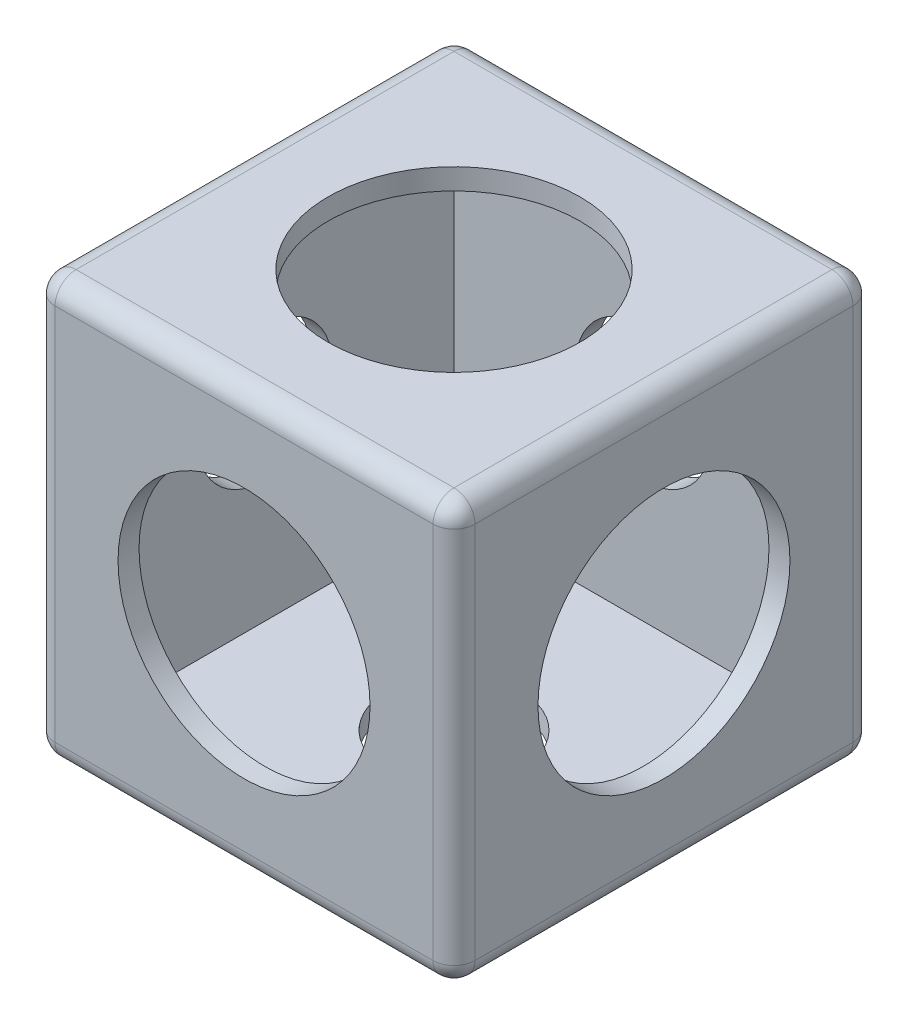
ISO-10303-21;
HEADER;
FILE_DESCRIPTION(('STEP AP214'),'2;1');
FILE_NAME('part.step','',(''),(''),'','','');
FILE_SCHEMA(('AUTOMOTIVE_DESIGN { 1 0 10303 214 1 1 1 1 }'));
ENDSEC;
DATA;
#1=APPLICATION_CONTEXT('core data for automotive mechanical design processes');
#2=APPLICATION_PROTOCOL_DEFINITION('international standard','automotive_design',2000,#1);
#3=PRODUCT_CONTEXT('',#1,'mechanical');
#4=PRODUCT('Part','Part','',(#3));
#5=PRODUCT_RELATED_PRODUCT_CATEGORY('part','',(#4));
#6=PRODUCT_DEFINITION_FORMATION('','',#4);
#7=PRODUCT_DEFINITION_CONTEXT('part definition',#1,'design');
#8=PRODUCT_DEFINITION('design','',#6,#7);
#9=PRODUCT_DEFINITION_SHAPE('','',#8);
#10=(LENGTH_UNIT() NAMED_UNIT(*) SI_UNIT(.MILLI.,.METRE.));
#11=(NAMED_UNIT(*) PLANE_ANGLE_UNIT() SI_UNIT($,.RADIAN.));
#12=(NAMED_UNIT(*) SI_UNIT($,.STERADIAN.) SOLID_ANGLE_UNIT());
#13=UNCERTAINTY_MEASURE_WITH_UNIT(LENGTH_MEASURE(1.E-05),#10,'distance_accuracy_value','');
#14=(GEOMETRIC_REPRESENTATION_CONTEXT(3) GLOBAL_UNCERTAINTY_ASSIGNED_CONTEXT((#13)) GLOBAL_UNIT_ASSIGNED_CONTEXT((#10,
#11,#12)) REPRESENTATION_CONTEXT('',''));
#15=CARTESIAN_POINT('',(0.,0.,0.));
#16=DIRECTION('',(0.,0.,1.));
#17=DIRECTION('',(1.,0.,0.));
#18=AXIS2_PLACEMENT_3D('',#15,#16,#17);
#19=CARTESIAN_POINT('',(0.,0.5,0.));
#20=DIRECTION('',(0.,-1.,0.));
#21=DIRECTION('',(0.,0.,-1.));
#22=AXIS2_PLACEMENT_3D('',#19,#20,#21);
#23=PLANE('',#22);
#24=DIRECTION('',(-1.,0.,0.));
#25=VECTOR('',#24,1.);
#26=CARTESIAN_POINT('',(0.5,0.5,-9.5));
#27=LINE('',#26,#25);
#28=CARTESIAN_POINT('',(9.5,0.5,-9.5));
#29=VERTEX_POINT('',#28);
#30=CARTESIAN_POINT('',(0.5,0.5,-9.5));
#31=VERTEX_POINT('',#30);
#32=EDGE_CURVE('E175',#29,#31,#27,.T.);
#33=ORIENTED_EDGE('',*,*,#32,.T.);
#34=DIRECTION('',(0.,0.,1.));
#35=VECTOR('',#34,1.);
#36=CARTESIAN_POINT('',(0.5,0.5,-0.5));
#37=LINE('',#36,#35);
#38=CARTESIAN_POINT('',(0.5,0.5,-0.5));
#39=VERTEX_POINT('',#38);
#40=EDGE_CURVE('E339',#31,#39,#37,.T.);
#41=ORIENTED_EDGE('',*,*,#40,.T.);
#42=DIRECTION('',(1.,0.,0.));
#43=VECTOR('',#42,1.);
#44=CARTESIAN_POINT('',(0.5,0.5,-0.5));
#45=LINE('',#44,#43);
#46=CARTESIAN_POINT('',(9.5,0.5,-0.5));
#47=VERTEX_POINT('',#46);
#48=EDGE_CURVE('E179',#39,#47,#45,.T.);
#49=ORIENTED_EDGE('',*,*,#48,.T.);
#50=DIRECTION('',(0.,0.,-1.));
#51=VECTOR('',#50,1.);
#52=CARTESIAN_POINT('',(9.5,0.5,-0.5));
#53=LINE('',#52,#51);
#54=EDGE_CURVE('E347',#47,#29,#53,.T.);
#55=ORIENTED_EDGE('',*,*,#54,.T.);
#56=EDGE_LOOP('',(#33,#41,#49,#55));
#57=FACE_BOUND('',#56,.T.);
#58=CARTESIAN_POINT('',(5.,0.5,-5.));
#59=DIRECTION('',(0.,1.,0.));
#60=DIRECTION('',(0.,0.,1.));
#61=AXIS2_PLACEMENT_3D('',#58,#59,#60);
#62=CIRCLE('',#61,1.6);
#63=CARTESIAN_POINT('',(5.,0.5,-3.4));
#64=VERTEX_POINT('',#63);
#65=EDGE_CURVE('E184',#64,#64,#62,.T.);
#66=ORIENTED_EDGE('',*,*,#65,.F.);
#67=EDGE_LOOP('',(#66));
#68=FACE_BOUND('',#67,.T.);
#69=ADVANCED_FACE('F39',(#57,#68),#23,.F.);
#70=CARTESIAN_POINT('',(0.,0.,0.));
#71=DIRECTION('',(0.,-1.,0.));
#72=DIRECTION('',(0.,0.,-1.));
#73=AXIS2_PLACEMENT_3D('',#70,#71,#72);
#74=PLANE('',#73);
#75=DIRECTION('',(1.,0.,0.));
#76=VECTOR('',#75,1.);
#77=CARTESIAN_POINT('',(0.,0.,-0.5));
#78=LINE('',#77,#76);
#79=CARTESIAN_POINT('',(9.49999999999999,0.,-0.5));
#80=VERTEX_POINT('',#79);
#81=CARTESIAN_POINT('',(0.5,0.,-0.5));
#82=VERTEX_POINT('',#81);
#83=EDGE_CURVE('E205',#80,#82,#78,.F.);
#84=ORIENTED_EDGE('',*,*,#83,.T.);
#85=DIRECTION('',(0.,0.,1.));
#86=VECTOR('',#85,1.);
#87=CARTESIAN_POINT('',(0.5,0.,-9.99999999999999));
#88=LINE('',#87,#86);
#89=CARTESIAN_POINT('',(0.5,0.,-9.49999999999999));
#90=VERTEX_POINT('',#89);
#91=EDGE_CURVE('E207',#82,#90,#88,.F.);
#92=ORIENTED_EDGE('',*,*,#91,.T.);
#93=DIRECTION('',(-1.,0.,0.));
#94=VECTOR('',#93,1.);
#95=CARTESIAN_POINT('',(9.99999999999999,0.,-9.49999999999999));
#96=LINE('',#95,#94);
#97=CARTESIAN_POINT('',(9.49999999999999,0.,-9.49999999999999));
#98=VERTEX_POINT('',#97);
#99=EDGE_CURVE('E201',#90,#98,#96,.F.);
#100=ORIENTED_EDGE('',*,*,#99,.T.);
#101=DIRECTION('',(0.,0.,-1.));
#102=VECTOR('',#101,1.);
#103=CARTESIAN_POINT('',(9.49999999999999,0.,0.));
#104=LINE('',#103,#102);
#105=EDGE_CURVE('E203',#98,#80,#104,.F.);
#106=ORIENTED_EDGE('',*,*,#105,.T.);
#107=EDGE_LOOP('',(#84,#92,#100,#106));
#108=FACE_BOUND('',#107,.T.);
#109=CARTESIAN_POINT('',(5.,0.,-5.));
#110=DIRECTION('',(0.,1.,0.));
#111=DIRECTION('',(0.,0.,1.));
#112=AXIS2_PLACEMENT_3D('',#109,#110,#111);
#113=CIRCLE('',#112,1.6);
#114=CARTESIAN_POINT('',(5.,0.,-3.4));
#115=VERTEX_POINT('',#114);
#116=EDGE_CURVE('E180',#115,#115,#113,.T.);
#117=ORIENTED_EDGE('',*,*,#116,.T.);
#118=EDGE_LOOP('',(#117));
#119=FACE_BOUND('',#118,.T.);
#120=ADVANCED_FACE('F362',(#108,#119),#74,.T.);
#121=CARTESIAN_POINT('',(0.,0.5,0.));
#122=DIRECTION('',(1.,0.,0.));
#123=DIRECTION('',(0.,0.,-1.));
#124=AXIS2_PLACEMENT_3D('',#121,#122,#123);
#125=PLANE('',#124);
#126=DIRECTION('',(0.,-1.,0.));
#127=VECTOR('',#126,1.);
#128=CARTESIAN_POINT('',(0.,0.5,-9.49999999999999));
#129=LINE('',#128,#127);
#130=CARTESIAN_POINT('',(0.,9.5,-9.49999999999999));
#131=VERTEX_POINT('',#130);
#132=CARTESIAN_POINT('',(0.,0.5,-9.49999999999999));
#133=VERTEX_POINT('',#132);
#134=EDGE_CURVE('E196',#131,#133,#129,.T.);
#135=ORIENTED_EDGE('',*,*,#134,.T.);
#136=DIRECTION('',(0.,0.,1.));
#137=VECTOR('',#136,1.);
#138=CARTESIAN_POINT('',(0.,0.5,0.));
#139=LINE('',#138,#137);
#140=CARTESIAN_POINT('',(0.,0.5,-0.5));
#141=VERTEX_POINT('',#140);
#142=EDGE_CURVE('E198',#133,#141,#139,.T.);
#143=ORIENTED_EDGE('',*,*,#142,.T.);
#144=DIRECTION('',(0.,-1.,0.));
#145=VECTOR('',#144,1.);
#146=CARTESIAN_POINT('',(0.,0.5,-0.5));
#147=LINE('',#146,#145);
#148=CARTESIAN_POINT('',(0.,9.5,-0.5));
#149=VERTEX_POINT('',#148);
#150=EDGE_CURVE('E194',#141,#149,#147,.F.);
#151=ORIENTED_EDGE('',*,*,#150,.T.);
#152=DIRECTION('',(0.,0.,1.));
#153=VECTOR('',#152,1.);
#154=CARTESIAN_POINT('',(0.,9.5,-10.));
#155=LINE('',#154,#153);
#156=EDGE_CURVE('E191',#149,#131,#155,.F.);
#157=ORIENTED_EDGE('',*,*,#156,.T.);
#158=EDGE_LOOP('',(#135,#143,#151,#157));
#159=FACE_BOUND('',#158,.T.);
#160=CARTESIAN_POINT('',(0.,5.,-5.));
#161=DIRECTION('',(-1.,0.,0.));
#162=DIRECTION('',(0.,0.,1.));
#163=AXIS2_PLACEMENT_3D('',#160,#161,#162);
#164=CIRCLE('',#163,1.6);
#165=CARTESIAN_POINT('',(0.,5.,-3.4));
#166=VERTEX_POINT('',#165);
#167=EDGE_CURVE('E315',#166,#166,#164,.T.);
#168=ORIENTED_EDGE('',*,*,#167,.F.);
#169=EDGE_LOOP('',(#168));
#170=FACE_BOUND('',#169,.T.);
#171=ADVANCED_FACE('F374',(#159,#170),#125,.F.);
#172=CARTESIAN_POINT('',(0.,0.5,0.));
#173=DIRECTION('',(0.,0.,-1.));
#174=DIRECTION('',(-1.,0.,0.));
#175=AXIS2_PLACEMENT_3D('',#172,#173,#174);
#176=PLANE('',#175);
#177=DIRECTION('',(1.,0.,0.));
#178=VECTOR('',#177,1.);
#179=CARTESIAN_POINT('',(0.,9.5,0.));
#180=LINE('',#179,#178);
#181=CARTESIAN_POINT('',(9.49999999999999,9.5,0.));
#182=VERTEX_POINT('',#181);
#183=CARTESIAN_POINT('',(0.5,9.5,0.));
#184=VERTEX_POINT('',#183);
#185=EDGE_CURVE('E223',#182,#184,#180,.F.);
#186=ORIENTED_EDGE('',*,*,#185,.T.);
#187=DIRECTION('',(0.,-1.,0.));
#188=VECTOR('',#187,1.);
#189=CARTESIAN_POINT('',(0.5,0.5,0.));
#190=LINE('',#189,#188);
#191=CARTESIAN_POINT('',(0.5,0.5,0.));
#192=VERTEX_POINT('',#191);
#193=EDGE_CURVE('E225',#184,#192,#190,.T.);
#194=ORIENTED_EDGE('',*,*,#193,.T.);
#195=DIRECTION('',(1.,0.,0.));
#196=VECTOR('',#195,1.);
#197=CARTESIAN_POINT('',(9.99999999999999,0.5,0.));
#198=LINE('',#197,#196);
#199=CARTESIAN_POINT('',(9.49999999999999,0.5,0.));
#200=VERTEX_POINT('',#199);
#201=EDGE_CURVE('E219',#192,#200,#198,.T.);
#202=ORIENTED_EDGE('',*,*,#201,.T.);
#203=DIRECTION('',(0.,-1.,0.));
#204=VECTOR('',#203,1.);
#205=CARTESIAN_POINT('',(9.49999999999999,0.5,0.));
#206=LINE('',#205,#204);
#207=EDGE_CURVE('E221',#200,#182,#206,.F.);
#208=ORIENTED_EDGE('',*,*,#207,.T.);
#209=EDGE_LOOP('',(#186,#194,#202,#208));
#210=FACE_BOUND('',#209,.T.);
#211=CARTESIAN_POINT('',(5.,5.,0.));
#212=DIRECTION('',(0.,0.,1.));
#213=DIRECTION('',(1.,0.,0.));
#214=AXIS2_PLACEMENT_3D('',#211,#212,#213);
#215=CIRCLE('',#214,3.);
#216=CARTESIAN_POINT('',(8.,5.,0.));
#217=VERTEX_POINT('',#216);
#218=EDGE_CURVE('E321',#217,#217,#215,.T.);
#219=ORIENTED_EDGE('',*,*,#218,.F.);
#220=EDGE_LOOP('',(#219));
#221=FACE_BOUND('',#220,.T.);
#222=ADVANCED_FACE('F381',(#210,#221),#176,.F.);
#223=CARTESIAN_POINT('',(9.99999999999999,0.5,0.));
#224=DIRECTION('',(-1.,0.,0.));
#225=DIRECTION('',(0.,0.,1.));
#226=AXIS2_PLACEMENT_3D('',#223,#224,#225);
#227=PLANE('',#226);
#228=DIRECTION('',(0.,0.,-1.));
#229=VECTOR('',#228,1.);
#230=CARTESIAN_POINT('',(9.99999999999999,9.5,0.));
#231=LINE('',#230,#229);
#232=CARTESIAN_POINT('',(9.99999999999999,9.5,-9.49999999999999));
#233=VERTEX_POINT('',#232);
#234=CARTESIAN_POINT('',(9.99999999999999,9.5,-0.5));
#235=VERTEX_POINT('',#234);
#236=EDGE_CURVE('E63',#233,#235,#231,.F.);
#237=ORIENTED_EDGE('',*,*,#236,.T.);
#238=DIRECTION('',(0.,-1.,0.));
#239=VECTOR('',#238,1.);
#240=CARTESIAN_POINT('',(9.99999999999999,0.5,-0.5));
#241=LINE('',#240,#239);
#242=CARTESIAN_POINT('',(9.99999999999999,0.5,-0.5));
#243=VERTEX_POINT('',#242);
#244=EDGE_CURVE('E11',#235,#243,#241,.T.);
#245=ORIENTED_EDGE('',*,*,#244,.T.);
#246=DIRECTION('',(0.,0.,-1.));
#247=VECTOR('',#246,1.);
#248=CARTESIAN_POINT('',(9.99999999999999,0.5,-9.99999999999999));
#249=LINE('',#248,#247);
#250=CARTESIAN_POINT('',(9.99999999999999,0.5,-9.49999999999999));
#251=VERTEX_POINT('',#250);
#252=EDGE_CURVE('E48',#243,#251,#249,.T.);
#253=ORIENTED_EDGE('',*,*,#252,.T.);
#254=DIRECTION('',(0.,-1.,0.));
#255=VECTOR('',#254,1.);
#256=CARTESIAN_POINT('',(9.99999999999999,0.5,-9.49999999999999));
#257=LINE('',#256,#255);
#258=EDGE_CURVE('E237',#251,#233,#257,.F.);
#259=ORIENTED_EDGE('',*,*,#258,.T.);
#260=EDGE_LOOP('',(#237,#245,#253,#259));
#261=FACE_BOUND('',#260,.T.);
#262=CARTESIAN_POINT('',(9.99999999999999,5.,-5.));
#263=DIRECTION('',(1.,0.,0.));
#264=DIRECTION('',(0.,0.,-1.));
#265=AXIS2_PLACEMENT_3D('',#262,#263,#264);
#266=CIRCLE('',#265,3.);
#267=CARTESIAN_POINT('',(9.99999999999999,5.,-8.));
#268=VERTEX_POINT('',#267);
#269=EDGE_CURVE('E327',#268,#268,#266,.T.);
#270=ORIENTED_EDGE('',*,*,#269,.F.);
#271=EDGE_LOOP('',(#270));
#272=FACE_BOUND('',#271,.T.);
#273=ADVANCED_FACE('F387',(#261,#272),#227,.F.);
#274=CARTESIAN_POINT('',(0.,0.5,-9.99999999999999));
#275=DIRECTION('',(0.,0.,1.));
#276=DIRECTION('',(1.,0.,0.));
#277=AXIS2_PLACEMENT_3D('',#274,#275,#276);
#278=PLANE('',#277);
#279=DIRECTION('',(-1.,0.,0.));
#280=VECTOR('',#279,1.);
#281=CARTESIAN_POINT('',(0.,0.5,-9.99999999999999));
#282=LINE('',#281,#280);
#283=CARTESIAN_POINT('',(9.49999999999999,0.5,-9.99999999999999));
#284=VERTEX_POINT('',#283);
#285=CARTESIAN_POINT('',(0.5,0.5,-9.99999999999999));
#286=VERTEX_POINT('',#285);
#287=EDGE_CURVE('E214',#284,#286,#282,.T.);
#288=ORIENTED_EDGE('',*,*,#287,.T.);
#289=DIRECTION('',(0.,-1.,0.));
#290=VECTOR('',#289,1.);
#291=CARTESIAN_POINT('',(0.5,0.5,-9.99999999999999));
#292=LINE('',#291,#290);
#293=CARTESIAN_POINT('',(0.5,9.5,-9.99999999999999));
#294=VERTEX_POINT('',#293);
#295=EDGE_CURVE('E216',#286,#294,#292,.F.);
#296=ORIENTED_EDGE('',*,*,#295,.T.);
#297=DIRECTION('',(-1.,0.,0.));
#298=VECTOR('',#297,1.);
#299=CARTESIAN_POINT('',(10.,9.5,-9.99999999999999));
#300=LINE('',#299,#298);
#301=CARTESIAN_POINT('',(9.49999999999999,9.5,-9.99999999999999));
#302=VERTEX_POINT('',#301);
#303=EDGE_CURVE('E212',#294,#302,#300,.F.);
#304=ORIENTED_EDGE('',*,*,#303,.T.);
#305=DIRECTION('',(0.,-1.,0.));
#306=VECTOR('',#305,1.);
#307=CARTESIAN_POINT('',(9.49999999999999,0.5,-9.99999999999999));
#308=LINE('',#307,#306);
#309=EDGE_CURVE('E210',#302,#284,#308,.T.);
#310=ORIENTED_EDGE('',*,*,#309,.T.);
#311=EDGE_LOOP('',(#288,#296,#304,#310));
#312=FACE_BOUND('',#311,.T.);
#313=CARTESIAN_POINT('',(5.,5.,-9.99999999999999));
#314=DIRECTION('',(0.,0.,-1.));
#315=DIRECTION('',(-1.,0.,0.));
#316=AXIS2_PLACEMENT_3D('',#313,#314,#315);
#317=CIRCLE('',#316,1.6);
#318=CARTESIAN_POINT('',(3.4,5.,-9.99999999999999));
#319=VERTEX_POINT('',#318);
#320=EDGE_CURVE('E304',#319,#319,#317,.T.);
#321=ORIENTED_EDGE('',*,*,#320,.F.);
#322=EDGE_LOOP('',(#321));
#323=FACE_BOUND('',#322,.T.);
#324=ADVANCED_FACE('F369',(#312,#323),#278,.F.);
#325=CARTESIAN_POINT('',(5.,0.5,-5.));
#326=DIRECTION('',(0.,-1.,0.));
#327=DIRECTION('',(0.,0.,-1.));
#328=AXIS2_PLACEMENT_3D('',#325,#326,#327);
#329=CYLINDRICAL_SURFACE('',#328,1.6);
#330=ORIENTED_EDGE('',*,*,#65,.T.);
#331=EDGE_LOOP('',(#330));
#332=FACE_BOUND('',#331,.T.);
#333=ORIENTED_EDGE('',*,*,#116,.F.);
#334=EDGE_LOOP('',(#333));
#335=FACE_BOUND('',#334,.T.);
#336=ADVANCED_FACE('F366',(#332,#335),#329,.F.);
#337=CARTESIAN_POINT('',(0.5,9.5,-0.5));
#338=DIRECTION('',(1.,0.,0.));
#339=DIRECTION('',(0.,0.,-1.));
#340=AXIS2_PLACEMENT_3D('',#337,#338,#339);
#341=PLANE('',#340);
#342=CARTESIAN_POINT('',(0.5,5.,-5.));
#343=DIRECTION('',(-1.,0.,0.));
#344=DIRECTION('',(0.,0.,1.));
#345=AXIS2_PLACEMENT_3D('',#342,#343,#344);
#346=CIRCLE('',#345,1.6);
#347=CARTESIAN_POINT('',(0.5,5.,-3.4));
#348=VERTEX_POINT('',#347);
#349=EDGE_CURVE('E318',#348,#348,#346,.T.);
#350=ORIENTED_EDGE('',*,*,#349,.T.);
#351=EDGE_LOOP('',(#350));
#352=FACE_BOUND('',#351,.T.);
#353=ORIENTED_EDGE('',*,*,#40,.F.);
#354=DIRECTION('',(0.,-1.,0.));
#355=VECTOR('',#354,1.);
#356=CARTESIAN_POINT('',(0.5,9.5,-9.5));
#357=LINE('',#356,#355);
#358=CARTESIAN_POINT('',(0.5,9.5,-9.5));
#359=VERTEX_POINT('',#358);
#360=EDGE_CURVE('E174',#359,#31,#357,.T.);
#361=ORIENTED_EDGE('',*,*,#360,.F.);
#362=DIRECTION('',(0.,0.,1.));
#363=VECTOR('',#362,1.);
#364=CARTESIAN_POINT('',(0.5,9.5,-0.5));
#365=LINE('',#364,#363);
#366=CARTESIAN_POINT('',(0.5,9.5,-0.5));
#367=VERTEX_POINT('',#366);
#368=EDGE_CURVE('E159',#359,#367,#365,.T.);
#369=ORIENTED_EDGE('',*,*,#368,.T.);
#370=DIRECTION('',(0.,-1.,0.));
#371=VECTOR('',#370,1.);
#372=CARTESIAN_POINT('',(0.5,9.5,-0.5));
#373=LINE('',#372,#371);
#374=EDGE_CURVE('E172',#367,#39,#373,.T.);
#375=ORIENTED_EDGE('',*,*,#374,.T.);
#376=EDGE_LOOP('',(#353,#361,#369,#375));
#377=FACE_BOUND('',#376,.T.);
#378=ADVANCED_FACE('F171',(#352,#377),#341,.T.);
#379=CARTESIAN_POINT('',(0.5,9.5,-0.5));
#380=DIRECTION('',(0.,0.,-1.));
#381=DIRECTION('',(-1.,0.,0.));
#382=AXIS2_PLACEMENT_3D('',#379,#380,#381);
#383=PLANE('',#382);
#384=CARTESIAN_POINT('',(5.,5.,-0.5));
#385=DIRECTION('',(0.,0.,1.));
#386=DIRECTION('',(1.,0.,0.));
#387=AXIS2_PLACEMENT_3D('',#384,#385,#386);
#388=CIRCLE('',#387,3.);
#389=CARTESIAN_POINT('',(8.,5.,-0.5));
#390=VERTEX_POINT('',#389);
#391=EDGE_CURVE('E324',#390,#390,#388,.T.);
#392=ORIENTED_EDGE('',*,*,#391,.T.);
#393=EDGE_LOOP('',(#392));
#394=FACE_BOUND('',#393,.T.);
#395=ORIENTED_EDGE('',*,*,#48,.F.);
#396=ORIENTED_EDGE('',*,*,#374,.F.);
#397=DIRECTION('',(1.,0.,0.));
#398=VECTOR('',#397,1.);
#399=CARTESIAN_POINT('',(0.5,9.5,-0.5));
#400=LINE('',#399,#398);
#401=CARTESIAN_POINT('',(9.5,9.5,-0.5));
#402=VERTEX_POINT('',#401);
#403=EDGE_CURVE('E155',#367,#402,#400,.T.);
#404=ORIENTED_EDGE('',*,*,#403,.T.);
#405=DIRECTION('',(0.,-1.,0.));
#406=VECTOR('',#405,1.);
#407=CARTESIAN_POINT('',(9.5,9.5,-0.5));
#408=LINE('',#407,#406);
#409=EDGE_CURVE('E181',#402,#47,#408,.T.);
#410=ORIENTED_EDGE('',*,*,#409,.T.);
#411=EDGE_LOOP('',(#395,#396,#404,#410));
#412=FACE_BOUND('',#411,.T.);
#413=ADVANCED_FACE('F177',(#394,#412),#383,.T.);
#414=CARTESIAN_POINT('',(9.5,9.5,-0.5));
#415=DIRECTION('',(-1.,0.,0.));
#416=DIRECTION('',(0.,0.,1.));
#417=AXIS2_PLACEMENT_3D('',#414,#415,#416);
#418=PLANE('',#417);
#419=CARTESIAN_POINT('',(9.49999999999999,5.,-5.));
#420=DIRECTION('',(1.,0.,0.));
#421=DIRECTION('',(0.,0.,-1.));
#422=AXIS2_PLACEMENT_3D('',#419,#420,#421);
#423=CIRCLE('',#422,3.);
#424=CARTESIAN_POINT('',(9.49999999999999,5.,-8.));
#425=VERTEX_POINT('',#424);
#426=EDGE_CURVE('E330',#425,#425,#423,.T.);
#427=ORIENTED_EDGE('',*,*,#426,.T.);
#428=EDGE_LOOP('',(#427));
#429=FACE_BOUND('',#428,.T.);
#430=ORIENTED_EDGE('',*,*,#54,.F.);
#431=ORIENTED_EDGE('',*,*,#409,.F.);
#432=DIRECTION('',(0.,0.,-1.));
#433=VECTOR('',#432,1.);
#434=CARTESIAN_POINT('',(9.5,9.5,-0.5));
#435=LINE('',#434,#433);
#436=CARTESIAN_POINT('',(9.5,9.5,-9.5));
#437=VERTEX_POINT('',#436);
#438=EDGE_CURVE('E162',#402,#437,#435,.T.);
#439=ORIENTED_EDGE('',*,*,#438,.T.);
#440=DIRECTION('',(0.,-1.,0.));
#441=VECTOR('',#440,1.);
#442=CARTESIAN_POINT('',(9.5,9.5,-9.5));
#443=LINE('',#442,#441);
#444=EDGE_CURVE('E186',#437,#29,#443,.T.);
#445=ORIENTED_EDGE('',*,*,#444,.T.);
#446=EDGE_LOOP('',(#430,#431,#439,#445));
#447=FACE_BOUND('',#446,.T.);
#448=ADVANCED_FACE('F356',(#429,#447),#418,.T.);
#449=CARTESIAN_POINT('',(0.5,9.5,-9.5));
#450=DIRECTION('',(0.,0.,1.));
#451=DIRECTION('',(1.,0.,0.));
#452=AXIS2_PLACEMENT_3D('',#449,#450,#451);
#453=PLANE('',#452);
#454=CARTESIAN_POINT('',(5.,5.,-9.49999999999999));
#455=DIRECTION('',(0.,0.,-1.));
#456=DIRECTION('',(-1.,0.,0.));
#457=AXIS2_PLACEMENT_3D('',#454,#455,#456);
#458=CIRCLE('',#457,1.6);
#459=CARTESIAN_POINT('',(3.4,5.,-9.49999999999999));
#460=VERTEX_POINT('',#459);
#461=EDGE_CURVE('E310',#460,#460,#458,.T.);
#462=ORIENTED_EDGE('',*,*,#461,.T.);
#463=EDGE_LOOP('',(#462));
#464=FACE_BOUND('',#463,.T.);
#465=ORIENTED_EDGE('',*,*,#32,.F.);
#466=ORIENTED_EDGE('',*,*,#444,.F.);
#467=DIRECTION('',(-1.,0.,0.));
#468=VECTOR('',#467,1.);
#469=CARTESIAN_POINT('',(0.5,9.5,-9.5));
#470=LINE('',#469,#468);
#471=EDGE_CURVE('E343',#437,#359,#470,.T.);
#472=ORIENTED_EDGE('',*,*,#471,.T.);
#473=ORIENTED_EDGE('',*,*,#360,.T.);
#474=EDGE_LOOP('',(#465,#466,#472,#473));
#475=FACE_BOUND('',#474,.T.);
#476=ADVANCED_FACE('F358',(#464,#475),#453,.T.);
#477=CARTESIAN_POINT('',(0.,10.,0.));
#478=DIRECTION('',(0.,1.,0.));
#479=DIRECTION('',(0.,0.,1.));
#480=AXIS2_PLACEMENT_3D('',#477,#478,#479);
#481=PLANE('',#480);
#482=DIRECTION('',(-1.,0.,0.));
#483=VECTOR('',#482,1.);
#484=CARTESIAN_POINT('',(0.,10.,-9.49999999999999));
#485=LINE('',#484,#483);
#486=CARTESIAN_POINT('',(9.49999999999999,10.,-9.49999999999999));
#487=VERTEX_POINT('',#486);
#488=CARTESIAN_POINT('',(0.5,10.,-9.49999999999999));
#489=VERTEX_POINT('',#488);
#490=EDGE_CURVE('E228',#487,#489,#485,.T.);
#491=ORIENTED_EDGE('',*,*,#490,.T.);
#492=DIRECTION('',(0.,0.,1.));
#493=VECTOR('',#492,1.);
#494=CARTESIAN_POINT('',(0.5,10.,0.));
#495=LINE('',#494,#493);
#496=CARTESIAN_POINT('',(0.5,10.,-0.5));
#497=VERTEX_POINT('',#496);
#498=EDGE_CURVE('E234',#489,#497,#495,.T.);
#499=ORIENTED_EDGE('',*,*,#498,.T.);
#500=DIRECTION('',(1.,0.,0.));
#501=VECTOR('',#500,1.);
#502=CARTESIAN_POINT('',(10.,10.,-0.5));
#503=LINE('',#502,#501);
#504=CARTESIAN_POINT('',(9.49999999999999,10.,-0.5));
#505=VERTEX_POINT('',#504);
#506=EDGE_CURVE('E232',#497,#505,#503,.T.);
#507=ORIENTED_EDGE('',*,*,#506,.T.);
#508=DIRECTION('',(0.,0.,-1.));
#509=VECTOR('',#508,1.);
#510=CARTESIAN_POINT('',(9.49999999999999,10.,-10.));
#511=LINE('',#510,#509);
#512=EDGE_CURVE('E230',#505,#487,#511,.T.);
#513=ORIENTED_EDGE('',*,*,#512,.T.);
#514=EDGE_LOOP('',(#491,#499,#507,#513));
#515=FACE_BOUND('',#514,.T.);
#516=CARTESIAN_POINT('',(5.,10.,-5.));
#517=DIRECTION('',(0.,1.,0.));
#518=DIRECTION('',(0.,0.,1.));
#519=AXIS2_PLACEMENT_3D('',#516,#517,#518);
#520=CIRCLE('',#519,3.);
#521=CARTESIAN_POINT('',(5.,10.,-2.));
#522=VERTEX_POINT('',#521);
#523=EDGE_CURVE('E336',#522,#522,#520,.T.);
#524=ORIENTED_EDGE('',*,*,#523,.F.);
#525=EDGE_LOOP('',(#524));
#526=FACE_BOUND('',#525,.T.);
#527=ADVANCED_FACE('F476',(#515,#526),#481,.T.);
#528=CARTESIAN_POINT('',(0.,9.5,0.));
#529=DIRECTION('',(0.,1.,0.));
#530=DIRECTION('',(0.,0.,1.));
#531=AXIS2_PLACEMENT_3D('',#528,#529,#530);
#532=PLANE('',#531);
#533=ORIENTED_EDGE('',*,*,#368,.F.);
#534=ORIENTED_EDGE('',*,*,#471,.F.);
#535=ORIENTED_EDGE('',*,*,#438,.F.);
#536=ORIENTED_EDGE('',*,*,#403,.F.);
#537=EDGE_LOOP('',(#533,#534,#535,#536));
#538=FACE_BOUND('',#537,.T.);
#539=CARTESIAN_POINT('',(5.,9.5,-5.));
#540=DIRECTION('',(0.,1.,0.));
#541=DIRECTION('',(0.,0.,1.));
#542=AXIS2_PLACEMENT_3D('',#539,#540,#541);
#543=CIRCLE('',#542,3.);
#544=CARTESIAN_POINT('',(5.,9.5,-2.));
#545=VERTEX_POINT('',#544);
#546=EDGE_CURVE('E333',#545,#545,#543,.T.);
#547=ORIENTED_EDGE('',*,*,#546,.T.);
#548=EDGE_LOOP('',(#547));
#549=FACE_BOUND('',#548,.T.);
#550=ADVANCED_FACE('F157',(#538,#549),#532,.F.);
#551=CARTESIAN_POINT('',(5.,10.,-5.));
#552=DIRECTION('',(0.,-1.,0.));
#553=DIRECTION('',(0.,0.,-1.));
#554=AXIS2_PLACEMENT_3D('',#551,#552,#553);
#555=CYLINDRICAL_SURFACE('',#554,3.);
#556=ORIENTED_EDGE('',*,*,#523,.T.);
#557=EDGE_LOOP('',(#556));
#558=FACE_BOUND('',#557,.T.);
#559=ORIENTED_EDGE('',*,*,#546,.F.);
#560=EDGE_LOOP('',(#559));
#561=FACE_BOUND('',#560,.T.);
#562=ADVANCED_FACE('F531',(#558,#561),#555,.F.);
#563=CARTESIAN_POINT('',(9.49999999999999,5.,-5.));
#564=DIRECTION('',(1.,0.,0.));
#565=DIRECTION('',(0.,0.,-1.));
#566=AXIS2_PLACEMENT_3D('',#563,#564,#565);
#567=CYLINDRICAL_SURFACE('',#566,3.);
#568=ORIENTED_EDGE('',*,*,#426,.F.);
#569=EDGE_LOOP('',(#568));
#570=FACE_BOUND('',#569,.T.);
#571=ORIENTED_EDGE('',*,*,#269,.T.);
#572=EDGE_LOOP('',(#571));
#573=FACE_BOUND('',#572,.T.);
#574=ADVANCED_FACE('F520',(#570,#573),#567,.F.);
#575=CARTESIAN_POINT('',(5.,5.,-0.5));
#576=DIRECTION('',(0.,0.,1.));
#577=DIRECTION('',(1.,0.,0.));
#578=AXIS2_PLACEMENT_3D('',#575,#576,#577);
#579=CYLINDRICAL_SURFACE('',#578,3.);
#580=ORIENTED_EDGE('',*,*,#391,.F.);
#581=EDGE_LOOP('',(#580));
#582=FACE_BOUND('',#581,.T.);
#583=ORIENTED_EDGE('',*,*,#218,.T.);
#584=EDGE_LOOP('',(#583));
#585=FACE_BOUND('',#584,.T.);
#586=ADVANCED_FACE('F517',(#582,#585),#579,.F.);
#587=CARTESIAN_POINT('',(0.5,5.,-5.));
#588=DIRECTION('',(-1.,0.,0.));
#589=DIRECTION('',(0.,0.,1.));
#590=AXIS2_PLACEMENT_3D('',#587,#588,#589);
#591=CYLINDRICAL_SURFACE('',#590,1.6);
#592=ORIENTED_EDGE('',*,*,#349,.F.);
#593=EDGE_LOOP('',(#592));
#594=FACE_BOUND('',#593,.T.);
#595=ORIENTED_EDGE('',*,*,#167,.T.);
#596=EDGE_LOOP('',(#595));
#597=FACE_BOUND('',#596,.T.);
#598=ADVANCED_FACE('F519',(#594,#597),#591,.F.);
#599=CARTESIAN_POINT('',(5.,5.,-9.49999999999999));
#600=DIRECTION('',(0.,0.,-1.));
#601=DIRECTION('',(-1.,0.,0.));
#602=AXIS2_PLACEMENT_3D('',#599,#600,#601);
#603=CYLINDRICAL_SURFACE('',#602,1.6);
#604=ORIENTED_EDGE('',*,*,#461,.F.);
#605=EDGE_LOOP('',(#604));
#606=FACE_BOUND('',#605,.T.);
#607=ORIENTED_EDGE('',*,*,#320,.T.);
#608=EDGE_LOOP('',(#607));
#609=FACE_BOUND('',#608,.T.);
#610=ADVANCED_FACE('F468',(#606,#609),#603,.F.);
#611=CARTESIAN_POINT('',(9.49999999999999,9.5,0.));
#612=DIRECTION('',(0.,0.,1.));
#613=DIRECTION('',(1.,0.,0.));
#614=AXIS2_PLACEMENT_3D('',#611,#612,#613);
#615=CYLINDRICAL_SURFACE('',#614,0.5);
#616=CARTESIAN_POINT('',(9.49999999999999,9.5,-9.49999999999999));
#617=DIRECTION('',(0.,0.,-1.));
#618=DIRECTION('',(-1.,0.,0.));
#619=AXIS2_PLACEMENT_3D('',#616,#617,#618);
#620=CIRCLE('',#619,0.5);
#621=EDGE_CURVE('E43',#487,#233,#620,.T.);
#622=ORIENTED_EDGE('',*,*,#621,.F.);
#623=ORIENTED_EDGE('',*,*,#512,.F.);
#624=CARTESIAN_POINT('',(9.49999999999999,9.5,-0.5));
#625=DIRECTION('',(0.,0.,1.));
#626=DIRECTION('',(1.,0.,0.));
#627=AXIS2_PLACEMENT_3D('',#624,#625,#626);
#628=CIRCLE('',#627,0.5);
#629=EDGE_CURVE('E298',#235,#505,#628,.T.);
#630=ORIENTED_EDGE('',*,*,#629,.F.);
#631=ORIENTED_EDGE('',*,*,#236,.F.);
#632=EDGE_LOOP('',(#622,#623,#630,#631));
#633=FACE_BOUND('',#632,.T.);
#634=ADVANCED_FACE('F41',(#633),#615,.T.);
#635=CARTESIAN_POINT('',(9.49999999999999,9.5,-9.49999999999999));
#636=DIRECTION('',(0.,0.,1.));
#637=DIRECTION('',(1.,0.,0.));
#638=AXIS2_PLACEMENT_3D('',#635,#636,#637);
#639=SPHERICAL_SURFACE('',#638,0.5);
#640=CARTESIAN_POINT('',(9.49999999999999,9.5,-9.49999999999999));
#641=DIRECTION('',(1.,0.,0.));
#642=DIRECTION('',(0.,0.,-1.));
#643=AXIS2_PLACEMENT_3D('',#640,#641,#642);
#644=CIRCLE('',#643,0.5);
#645=EDGE_CURVE('E293',#487,#302,#644,.F.);
#646=ORIENTED_EDGE('',*,*,#645,.F.);
#647=ORIENTED_EDGE('',*,*,#621,.T.);
#648=CARTESIAN_POINT('',(9.49999999999999,9.5,-9.49999999999999));
#649=DIRECTION('',(0.,1.,0.));
#650=DIRECTION('',(0.,0.,1.));
#651=AXIS2_PLACEMENT_3D('',#648,#649,#650);
#652=CIRCLE('',#651,0.5);
#653=EDGE_CURVE('E296',#302,#233,#652,.F.);
#654=ORIENTED_EDGE('',*,*,#653,.F.);
#655=EDGE_LOOP('',(#646,#647,#654));
#656=FACE_BOUND('',#655,.T.);
#657=ADVANCED_FACE('F463',(#656),#639,.T.);
#658=CARTESIAN_POINT('',(9.49999999999999,9.5,-0.5));
#659=DIRECTION('',(0.,0.,1.));
#660=DIRECTION('',(1.,0.,0.));
#661=AXIS2_PLACEMENT_3D('',#658,#659,#660);
#662=SPHERICAL_SURFACE('',#661,0.5);
#663=CARTESIAN_POINT('',(9.49999999999999,9.5,-0.5));
#664=DIRECTION('',(0.,1.,0.));
#665=DIRECTION('',(0.,0.,1.));
#666=AXIS2_PLACEMENT_3D('',#663,#664,#665);
#667=CIRCLE('',#666,0.5);
#668=EDGE_CURVE('E287',#235,#182,#667,.F.);
#669=ORIENTED_EDGE('',*,*,#668,.F.);
#670=ORIENTED_EDGE('',*,*,#629,.T.);
#671=CARTESIAN_POINT('',(9.49999999999999,9.5,-0.5));
#672=DIRECTION('',(1.,0.,0.));
#673=DIRECTION('',(0.,0.,-1.));
#674=AXIS2_PLACEMENT_3D('',#671,#672,#673);
#675=CIRCLE('',#674,0.5);
#676=EDGE_CURVE('E290',#182,#505,#675,.F.);
#677=ORIENTED_EDGE('',*,*,#676,.F.);
#678=EDGE_LOOP('',(#669,#670,#677));
#679=FACE_BOUND('',#678,.T.);
#680=ADVANCED_FACE('F460',(#679),#662,.T.);
#681=CARTESIAN_POINT('',(9.49999999999999,0.5,-9.49999999999999));
#682=DIRECTION('',(0.,-1.,0.));
#683=DIRECTION('',(0.,0.,-1.));
#684=AXIS2_PLACEMENT_3D('',#681,#682,#683);
#685=CYLINDRICAL_SURFACE('',#684,0.5);
#686=ORIENTED_EDGE('',*,*,#653,.T.);
#687=ORIENTED_EDGE('',*,*,#258,.F.);
#688=CARTESIAN_POINT('',(9.49999999999999,0.5,-9.49999999999999));
#689=DIRECTION('',(0.,-1.,0.));
#690=DIRECTION('',(0.,0.,-1.));
#691=AXIS2_PLACEMENT_3D('',#688,#689,#690);
#692=CIRCLE('',#691,0.5);
#693=EDGE_CURVE('E281',#284,#251,#692,.T.);
#694=ORIENTED_EDGE('',*,*,#693,.F.);
#695=ORIENTED_EDGE('',*,*,#309,.F.);
#696=EDGE_LOOP('',(#686,#687,#694,#695));
#697=FACE_BOUND('',#696,.T.);
#698=ADVANCED_FACE('F456',(#697),#685,.T.);
#699=CARTESIAN_POINT('',(0.,9.5,-9.49999999999999));
#700=DIRECTION('',(1.,0.,0.));
#701=DIRECTION('',(0.,0.,-1.));
#702=AXIS2_PLACEMENT_3D('',#699,#700,#701);
#703=CYLINDRICAL_SURFACE('',#702,0.5);
#704=ORIENTED_EDGE('',*,*,#645,.T.);
#705=ORIENTED_EDGE('',*,*,#303,.F.);
#706=CARTESIAN_POINT('',(0.5,9.5,-9.49999999999999));
#707=DIRECTION('',(-1.,0.,0.));
#708=DIRECTION('',(0.,0.,1.));
#709=AXIS2_PLACEMENT_3D('',#706,#707,#708);
#710=CIRCLE('',#709,0.5);
#711=EDGE_CURVE('E278',#489,#294,#710,.T.);
#712=ORIENTED_EDGE('',*,*,#711,.F.);
#713=ORIENTED_EDGE('',*,*,#490,.F.);
#714=EDGE_LOOP('',(#704,#705,#712,#713));
#715=FACE_BOUND('',#714,.T.);
#716=ADVANCED_FACE('F452',(#715),#703,.T.);
#717=CARTESIAN_POINT('',(0.5,9.5,0.));
#718=DIRECTION('',(0.,0.,-1.));
#719=DIRECTION('',(-1.,0.,0.));
#720=AXIS2_PLACEMENT_3D('',#717,#718,#719);
#721=CYLINDRICAL_SURFACE('',#720,0.5);
#722=CARTESIAN_POINT('',(0.5,9.5,-0.5));
#723=DIRECTION('',(0.,0.,1.));
#724=DIRECTION('',(1.,0.,0.));
#725=AXIS2_PLACEMENT_3D('',#722,#723,#724);
#726=CIRCLE('',#725,0.5);
#727=EDGE_CURVE('E272',#497,#149,#726,.T.);
#728=ORIENTED_EDGE('',*,*,#727,.F.);
#729=ORIENTED_EDGE('',*,*,#498,.F.);
#730=CARTESIAN_POINT('',(0.5,9.5,-9.49999999999999));
#731=DIRECTION('',(0.,0.,-1.));
#732=DIRECTION('',(-1.,0.,0.));
#733=AXIS2_PLACEMENT_3D('',#730,#731,#732);
#734=CIRCLE('',#733,0.5);
#735=EDGE_CURVE('E275',#131,#489,#734,.T.);
#736=ORIENTED_EDGE('',*,*,#735,.F.);
#737=ORIENTED_EDGE('',*,*,#156,.F.);
#738=EDGE_LOOP('',(#728,#729,#736,#737));
#739=FACE_BOUND('',#738,.T.);
#740=ADVANCED_FACE('F448',(#739),#721,.T.);
#741=CARTESIAN_POINT('',(0.,9.5,-0.5));
#742=DIRECTION('',(-1.,0.,0.));
#743=DIRECTION('',(0.,0.,1.));
#744=AXIS2_PLACEMENT_3D('',#741,#742,#743);
#745=CYLINDRICAL_SURFACE('',#744,0.5);
#746=ORIENTED_EDGE('',*,*,#676,.T.);
#747=ORIENTED_EDGE('',*,*,#506,.F.);
#748=CARTESIAN_POINT('',(0.5,9.5,-0.5));
#749=DIRECTION('',(-1.,0.,0.));
#750=DIRECTION('',(0.,0.,1.));
#751=AXIS2_PLACEMENT_3D('',#748,#749,#750);
#752=CIRCLE('',#751,0.5);
#753=EDGE_CURVE('E270',#184,#497,#752,.T.);
#754=ORIENTED_EDGE('',*,*,#753,.F.);
#755=ORIENTED_EDGE('',*,*,#185,.F.);
#756=EDGE_LOOP('',(#746,#747,#754,#755));
#757=FACE_BOUND('',#756,.T.);
#758=ADVANCED_FACE('F444',(#757),#745,.T.);
#759=CARTESIAN_POINT('',(9.49999999999999,0.5,-0.5));
#760=DIRECTION('',(0.,-1.,0.));
#761=DIRECTION('',(0.,0.,-1.));
#762=AXIS2_PLACEMENT_3D('',#759,#760,#761);
#763=CYLINDRICAL_SURFACE('',#762,0.5);
#764=ORIENTED_EDGE('',*,*,#668,.T.);
#765=ORIENTED_EDGE('',*,*,#207,.F.);
#766=CARTESIAN_POINT('',(9.49999999999999,0.5,-0.5));
#767=DIRECTION('',(0.,-1.,0.));
#768=DIRECTION('',(0.,0.,-1.));
#769=AXIS2_PLACEMENT_3D('',#766,#767,#768);
#770=CIRCLE('',#769,0.5);
#771=EDGE_CURVE('E268',#243,#200,#770,.T.);
#772=ORIENTED_EDGE('',*,*,#771,.F.);
#773=ORIENTED_EDGE('',*,*,#244,.F.);
#774=EDGE_LOOP('',(#764,#765,#772,#773));
#775=FACE_BOUND('',#774,.T.);
#776=ADVANCED_FACE('F440',(#775),#763,.T.);
#777=CARTESIAN_POINT('',(9.49999999999999,0.5,0.));
#778=DIRECTION('',(0.,0.,1.));
#779=DIRECTION('',(1.,0.,0.));
#780=AXIS2_PLACEMENT_3D('',#777,#778,#779);
#781=CYLINDRICAL_SURFACE('',#780,0.5);
#782=CARTESIAN_POINT('',(9.49999999999999,0.5,-9.49999999999999));
#783=DIRECTION('',(0.,0.,-1.));
#784=DIRECTION('',(-1.,0.,0.));
#785=AXIS2_PLACEMENT_3D('',#782,#783,#784);
#786=CIRCLE('',#785,0.5);
#787=EDGE_CURVE('E284',#251,#98,#786,.T.);
#788=ORIENTED_EDGE('',*,*,#787,.F.);
#789=ORIENTED_EDGE('',*,*,#252,.F.);
#790=CARTESIAN_POINT('',(9.49999999999999,0.5,-0.5));
#791=DIRECTION('',(0.,0.,1.));
#792=DIRECTION('',(1.,0.,0.));
#793=AXIS2_PLACEMENT_3D('',#790,#791,#792);
#794=CIRCLE('',#793,0.5);
#795=EDGE_CURVE('E56',#80,#243,#794,.T.);
#796=ORIENTED_EDGE('',*,*,#795,.F.);
#797=ORIENTED_EDGE('',*,*,#105,.F.);
#798=EDGE_LOOP('',(#788,#789,#796,#797));
#799=FACE_BOUND('',#798,.T.);
#800=ADVANCED_FACE('F436',(#799),#781,.T.);
#801=CARTESIAN_POINT('',(9.49999999999999,0.5,-9.49999999999999));
#802=DIRECTION('',(0.,0.,1.));
#803=DIRECTION('',(1.,0.,0.));
#804=AXIS2_PLACEMENT_3D('',#801,#802,#803);
#805=SPHERICAL_SURFACE('',#804,0.5);
#806=ORIENTED_EDGE('',*,*,#693,.T.);
#807=ORIENTED_EDGE('',*,*,#787,.T.);
#808=CARTESIAN_POINT('',(9.49999999999999,0.5,-9.49999999999999));
#809=DIRECTION('',(1.,0.,0.));
#810=DIRECTION('',(0.,0.,-1.));
#811=AXIS2_PLACEMENT_3D('',#808,#809,#810);
#812=CIRCLE('',#811,0.5);
#813=EDGE_CURVE('E264',#284,#98,#812,.F.);
#814=ORIENTED_EDGE('',*,*,#813,.F.);
#815=EDGE_LOOP('',(#806,#807,#814));
#816=FACE_BOUND('',#815,.T.);
#817=ADVANCED_FACE('F432',(#816),#805,.T.);
#818=CARTESIAN_POINT('',(0.5,9.5,-9.49999999999999));
#819=DIRECTION('',(0.,0.,1.));
#820=DIRECTION('',(1.,0.,0.));
#821=AXIS2_PLACEMENT_3D('',#818,#819,#820);
#822=SPHERICAL_SURFACE('',#821,0.5);
#823=ORIENTED_EDGE('',*,*,#735,.T.);
#824=ORIENTED_EDGE('',*,*,#711,.T.);
#825=CARTESIAN_POINT('',(0.5,9.5,-9.49999999999999));
#826=DIRECTION('',(0.,1.,0.));
#827=DIRECTION('',(0.,0.,1.));
#828=AXIS2_PLACEMENT_3D('',#825,#826,#827);
#829=CIRCLE('',#828,0.5);
#830=EDGE_CURVE('E262',#131,#294,#829,.F.);
#831=ORIENTED_EDGE('',*,*,#830,.F.);
#832=EDGE_LOOP('',(#823,#824,#831));
#833=FACE_BOUND('',#832,.T.);
#834=ADVANCED_FACE('F428',(#833),#822,.T.);
#835=CARTESIAN_POINT('',(0.5,9.5,-0.5));
#836=DIRECTION('',(0.,0.,1.));
#837=DIRECTION('',(1.,0.,0.));
#838=AXIS2_PLACEMENT_3D('',#835,#836,#837);
#839=SPHERICAL_SURFACE('',#838,0.5);
#840=ORIENTED_EDGE('',*,*,#753,.T.);
#841=ORIENTED_EDGE('',*,*,#727,.T.);
#842=CARTESIAN_POINT('',(0.5,9.5,-0.5));
#843=DIRECTION('',(0.,1.,0.));
#844=DIRECTION('',(0.,0.,1.));
#845=AXIS2_PLACEMENT_3D('',#842,#843,#844);
#846=CIRCLE('',#845,0.5);
#847=EDGE_CURVE('E259',#184,#149,#846,.F.);
#848=ORIENTED_EDGE('',*,*,#847,.F.);
#849=EDGE_LOOP('',(#840,#841,#848));
#850=FACE_BOUND('',#849,.T.);
#851=ADVANCED_FACE('F425',(#850),#839,.T.);
#852=CARTESIAN_POINT('',(9.49999999999999,0.5,-0.5));
#853=DIRECTION('',(0.,0.,1.));
#854=DIRECTION('',(1.,0.,0.));
#855=AXIS2_PLACEMENT_3D('',#852,#853,#854);
#856=SPHERICAL_SURFACE('',#855,0.5);
#857=ORIENTED_EDGE('',*,*,#795,.T.);
#858=ORIENTED_EDGE('',*,*,#771,.T.);
#859=CARTESIAN_POINT('',(9.49999999999999,0.5,-0.5));
#860=DIRECTION('',(1.,0.,0.));
#861=DIRECTION('',(0.,0.,-1.));
#862=AXIS2_PLACEMENT_3D('',#859,#860,#861);
#863=CIRCLE('',#862,0.5);
#864=EDGE_CURVE('E256',#80,#200,#863,.F.);
#865=ORIENTED_EDGE('',*,*,#864,.F.);
#866=EDGE_LOOP('',(#857,#858,#865));
#867=FACE_BOUND('',#866,.T.);
#868=ADVANCED_FACE('F421',(#867),#856,.T.);
#869=CARTESIAN_POINT('',(0.,0.5,-9.49999999999999));
#870=DIRECTION('',(1.,0.,0.));
#871=DIRECTION('',(0.,0.,-1.));
#872=AXIS2_PLACEMENT_3D('',#869,#870,#871);
#873=CYLINDRICAL_SURFACE('',#872,0.5);
#874=ORIENTED_EDGE('',*,*,#813,.T.);
#875=ORIENTED_EDGE('',*,*,#99,.F.);
#876=CARTESIAN_POINT('',(0.5,0.5,-9.49999999999999));
#877=DIRECTION('',(-1.,0.,0.));
#878=DIRECTION('',(0.,0.,1.));
#879=AXIS2_PLACEMENT_3D('',#876,#877,#878);
#880=CIRCLE('',#879,0.5);
#881=EDGE_CURVE('E253',#286,#90,#880,.T.);
#882=ORIENTED_EDGE('',*,*,#881,.F.);
#883=ORIENTED_EDGE('',*,*,#287,.F.);
#884=EDGE_LOOP('',(#874,#875,#882,#883));
#885=FACE_BOUND('',#884,.T.);
#886=ADVANCED_FACE('F417',(#885),#873,.T.);
#887=CARTESIAN_POINT('',(0.5,0.5,-9.49999999999999));
#888=DIRECTION('',(0.,-1.,0.));
#889=DIRECTION('',(0.,0.,-1.));
#890=AXIS2_PLACEMENT_3D('',#887,#888,#889);
#891=CYLINDRICAL_SURFACE('',#890,0.5);
#892=ORIENTED_EDGE('',*,*,#830,.T.);
#893=ORIENTED_EDGE('',*,*,#295,.F.);
#894=CARTESIAN_POINT('',(0.5,0.5,-9.49999999999999));
#895=DIRECTION('',(0.,-1.,0.));
#896=DIRECTION('',(0.,0.,-1.));
#897=AXIS2_PLACEMENT_3D('',#894,#895,#896);
#898=CIRCLE('',#897,0.5);
#899=EDGE_CURVE('E250',#133,#286,#898,.T.);
#900=ORIENTED_EDGE('',*,*,#899,.F.);
#901=ORIENTED_EDGE('',*,*,#134,.F.);
#902=EDGE_LOOP('',(#892,#893,#900,#901));
#903=FACE_BOUND('',#902,.T.);
#904=ADVANCED_FACE('F413',(#903),#891,.T.);
#905=CARTESIAN_POINT('',(0.5,0.5,-0.5));
#906=DIRECTION('',(0.,-1.,0.));
#907=DIRECTION('',(0.,0.,-1.));
#908=AXIS2_PLACEMENT_3D('',#905,#906,#907);
#909=CYLINDRICAL_SURFACE('',#908,0.5);
#910=ORIENTED_EDGE('',*,*,#847,.T.);
#911=ORIENTED_EDGE('',*,*,#150,.F.);
#912=CARTESIAN_POINT('',(0.5,0.5,-0.5));
#913=DIRECTION('',(0.,-1.,0.));
#914=DIRECTION('',(0.,0.,-1.));
#915=AXIS2_PLACEMENT_3D('',#912,#913,#914);
#916=CIRCLE('',#915,0.5);
#917=EDGE_CURVE('E247',#192,#141,#916,.T.);
#918=ORIENTED_EDGE('',*,*,#917,.F.);
#919=ORIENTED_EDGE('',*,*,#193,.F.);
#920=EDGE_LOOP('',(#910,#911,#918,#919));
#921=FACE_BOUND('',#920,.T.);
#922=ADVANCED_FACE('F409',(#921),#909,.T.);
#923=CARTESIAN_POINT('',(0.,0.5,-0.5));
#924=DIRECTION('',(-1.,0.,0.));
#925=DIRECTION('',(0.,0.,1.));
#926=AXIS2_PLACEMENT_3D('',#923,#924,#925);
#927=CYLINDRICAL_SURFACE('',#926,0.5);
#928=ORIENTED_EDGE('',*,*,#864,.T.);
#929=ORIENTED_EDGE('',*,*,#201,.F.);
#930=CARTESIAN_POINT('',(0.5,0.5,-0.5));
#931=DIRECTION('',(-1.,0.,0.));
#932=DIRECTION('',(0.,0.,1.));
#933=AXIS2_PLACEMENT_3D('',#930,#931,#932);
#934=CIRCLE('',#933,0.5);
#935=EDGE_CURVE('E245',#82,#192,#934,.T.);
#936=ORIENTED_EDGE('',*,*,#935,.F.);
#937=ORIENTED_EDGE('',*,*,#83,.F.);
#938=EDGE_LOOP('',(#928,#929,#936,#937));
#939=FACE_BOUND('',#938,.T.);
#940=ADVANCED_FACE('F405',(#939),#927,.T.);
#941=CARTESIAN_POINT('',(0.5,0.5,-9.49999999999999));
#942=DIRECTION('',(0.,0.,1.));
#943=DIRECTION('',(1.,0.,0.));
#944=AXIS2_PLACEMENT_3D('',#941,#942,#943);
#945=SPHERICAL_SURFACE('',#944,0.5);
#946=ORIENTED_EDGE('',*,*,#899,.T.);
#947=ORIENTED_EDGE('',*,*,#881,.T.);
#948=CARTESIAN_POINT('',(0.5,0.5,-9.49999999999999));
#949=DIRECTION('',(0.,0.,-1.));
#950=DIRECTION('',(-1.,0.,0.));
#951=AXIS2_PLACEMENT_3D('',#948,#949,#950);
#952=CIRCLE('',#951,0.5);
#953=EDGE_CURVE('E243',#133,#90,#952,.F.);
#954=ORIENTED_EDGE('',*,*,#953,.F.);
#955=EDGE_LOOP('',(#946,#947,#954));
#956=FACE_BOUND('',#955,.T.);
#957=ADVANCED_FACE('F401',(#956),#945,.T.);
#958=CARTESIAN_POINT('',(0.5,0.5,-0.5));
#959=DIRECTION('',(0.,0.,1.));
#960=DIRECTION('',(1.,0.,0.));
#961=AXIS2_PLACEMENT_3D('',#958,#959,#960);
#962=SPHERICAL_SURFACE('',#961,0.5);
#963=ORIENTED_EDGE('',*,*,#935,.T.);
#964=ORIENTED_EDGE('',*,*,#917,.T.);
#965=CARTESIAN_POINT('',(0.5,0.5,-0.5));
#966=DIRECTION('',(0.,0.,1.));
#967=DIRECTION('',(1.,0.,0.));
#968=AXIS2_PLACEMENT_3D('',#965,#966,#967);
#969=CIRCLE('',#968,0.5);
#970=EDGE_CURVE('E241',#82,#141,#969,.F.);
#971=ORIENTED_EDGE('',*,*,#970,.F.);
#972=EDGE_LOOP('',(#963,#964,#971));
#973=FACE_BOUND('',#972,.T.);
#974=ADVANCED_FACE('F397',(#973),#962,.T.);
#975=CARTESIAN_POINT('',(0.5,0.5,0.));
#976=DIRECTION('',(0.,0.,-1.));
#977=DIRECTION('',(-1.,0.,0.));
#978=AXIS2_PLACEMENT_3D('',#975,#976,#977);
#979=CYLINDRICAL_SURFACE('',#978,0.5);
#980=ORIENTED_EDGE('',*,*,#953,.T.);
#981=ORIENTED_EDGE('',*,*,#91,.F.);
#982=ORIENTED_EDGE('',*,*,#970,.T.);
#983=ORIENTED_EDGE('',*,*,#142,.F.);
#984=EDGE_LOOP('',(#980,#981,#982,#983));
#985=FACE_BOUND('',#984,.T.);
#986=ADVANCED_FACE('F394',(#985),#979,.T.);
#987=CLOSED_SHELL('',(#69,#120,#171,#222,#273,#324,#336,#378,#413,#448,#476,#527,#550,#562,#574,
#586,#598,#610,#634,#657,#680,#698,#716,#740,#758,#776,#800,#817,#834,#851,#868,#886,#904,#922,
#940,#957,#974,#986));
#988=MANIFOLD_SOLID_BREP('B2',#987);
#989=ADVANCED_BREP_SHAPE_REPRESENTATION('',(#18,#988),#14);
#990=SHAPE_DEFINITION_REPRESENTATION(#9,#989);
ENDSEC;
END-ISO-10303-21;
